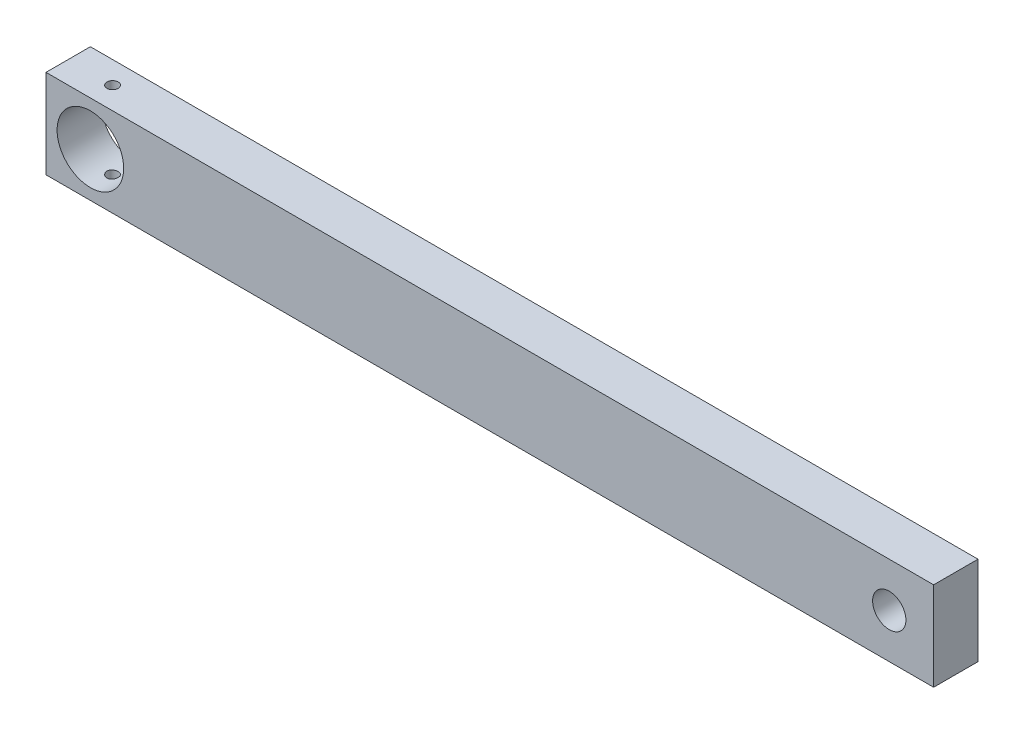
ISO-10303-21;
HEADER;
FILE_DESCRIPTION(('STEP AP214'),'2;1');
FILE_NAME('part.step','',(''),(''),'','','');
FILE_SCHEMA(('AUTOMOTIVE_DESIGN { 1 0 10303 214 1 1 1 1 }'));
ENDSEC;
DATA;
#1=APPLICATION_CONTEXT('core data for automotive mechanical design processes');
#2=APPLICATION_PROTOCOL_DEFINITION('international standard','automotive_design',2000,#1);
#3=PRODUCT_CONTEXT('',#1,'mechanical');
#4=PRODUCT('Part','Part','',(#3));
#5=PRODUCT_RELATED_PRODUCT_CATEGORY('part','',(#4));
#6=PRODUCT_DEFINITION_FORMATION('','',#4);
#7=PRODUCT_DEFINITION_CONTEXT('part definition',#1,'design');
#8=PRODUCT_DEFINITION('design','',#6,#7);
#9=PRODUCT_DEFINITION_SHAPE('','',#8);
#10=(LENGTH_UNIT() NAMED_UNIT(*) SI_UNIT(.MILLI.,.METRE.));
#11=(NAMED_UNIT(*) PLANE_ANGLE_UNIT() SI_UNIT($,.RADIAN.));
#12=(NAMED_UNIT(*) SI_UNIT($,.STERADIAN.) SOLID_ANGLE_UNIT());
#13=UNCERTAINTY_MEASURE_WITH_UNIT(LENGTH_MEASURE(1.E-05),#10,'distance_accuracy_value','');
#14=(GEOMETRIC_REPRESENTATION_CONTEXT(3) GLOBAL_UNCERTAINTY_ASSIGNED_CONTEXT((#13)) GLOBAL_UNIT_ASSIGNED_CONTEXT((#10,
#11,#12)) REPRESENTATION_CONTEXT('',''));
#15=CARTESIAN_POINT('',(0.,0.,0.));
#16=DIRECTION('',(0.,0.,1.));
#17=DIRECTION('',(1.,0.,0.));
#18=AXIS2_PLACEMENT_3D('',#15,#16,#17);
#19=CARTESIAN_POINT('',(0.,0.,6.35));
#20=DIRECTION('',(0.,0.,-1.));
#21=DIRECTION('',(-1.,0.,0.));
#22=AXIS2_PLACEMENT_3D('',#19,#20,#21);
#23=PLANE('',#22);
#24=DIRECTION('',(0.,-1.,0.));
#25=VECTOR('',#24,1.);
#26=CARTESIAN_POINT('',(0.,0.,6.35));
#27=LINE('',#26,#25);
#28=CARTESIAN_POINT('',(0.,12.7,6.35));
#29=VERTEX_POINT('',#28);
#30=CARTESIAN_POINT('',(0.,0.,6.35));
#31=VERTEX_POINT('',#30);
#32=EDGE_CURVE('E135',#29,#31,#27,.T.);
#33=ORIENTED_EDGE('',*,*,#32,.T.);
#34=DIRECTION('',(1.,0.,0.));
#35=VECTOR('',#34,1.);
#36=CARTESIAN_POINT('',(0.,0.,6.35));
#37=LINE('',#36,#35);
#38=CARTESIAN_POINT('',(127.,0.,6.35));
#39=VERTEX_POINT('',#38);
#40=EDGE_CURVE('E130',#31,#39,#37,.T.);
#41=ORIENTED_EDGE('',*,*,#40,.T.);
#42=DIRECTION('',(0.,1.,0.));
#43=VECTOR('',#42,1.);
#44=CARTESIAN_POINT('',(127.,0.,6.35));
#45=LINE('',#44,#43);
#46=CARTESIAN_POINT('',(127.,12.7,6.35));
#47=VERTEX_POINT('',#46);
#48=EDGE_CURVE('E133',#39,#47,#45,.T.);
#49=ORIENTED_EDGE('',*,*,#48,.T.);
#50=DIRECTION('',(-1.,0.,0.));
#51=VECTOR('',#50,1.);
#52=CARTESIAN_POINT('',(0.,12.7,6.35));
#53=LINE('',#52,#51);
#54=EDGE_CURVE('E100',#47,#29,#53,.T.);
#55=ORIENTED_EDGE('',*,*,#54,.T.);
#56=EDGE_LOOP('',(#33,#41,#49,#55));
#57=FACE_BOUND('',#56,.T.);
#58=CARTESIAN_POINT('',(6.35,6.35,6.35));
#59=DIRECTION('',(0.,0.,1.));
#60=DIRECTION('',(1.,0.,0.));
#61=AXIS2_PLACEMENT_3D('',#58,#59,#60);
#62=CIRCLE('',#61,4.7625);
#63=CARTESIAN_POINT('',(11.1125,6.35,6.35));
#64=VERTEX_POINT('',#63);
#65=EDGE_CURVE('E158',#64,#64,#62,.T.);
#66=ORIENTED_EDGE('',*,*,#65,.F.);
#67=EDGE_LOOP('',(#66));
#68=FACE_BOUND('',#67,.T.);
#69=CARTESIAN_POINT('',(120.65,6.35,6.35));
#70=DIRECTION('',(0.,0.,1.));
#71=DIRECTION('',(1.,0.,0.));
#72=AXIS2_PLACEMENT_3D('',#69,#70,#71);
#73=CIRCLE('',#72,2.38125000000001);
#74=CARTESIAN_POINT('',(123.03125,6.35,6.35));
#75=VERTEX_POINT('',#74);
#76=EDGE_CURVE('E225',#75,#75,#73,.T.);
#77=ORIENTED_EDGE('',*,*,#76,.F.);
#78=EDGE_LOOP('',(#77));
#79=FACE_BOUND('',#78,.T.);
#80=ADVANCED_FACE('F75',(#57,#68,#79),#23,.F.);
#81=CARTESIAN_POINT('',(0.,0.,0.));
#82=DIRECTION('',(0.,0.,-1.));
#83=DIRECTION('',(-1.,0.,0.));
#84=AXIS2_PLACEMENT_3D('',#81,#82,#83);
#85=PLANE('',#84);
#86=CARTESIAN_POINT('',(6.35,6.35,0.));
#87=DIRECTION('',(0.,0.,1.));
#88=DIRECTION('',(1.,0.,0.));
#89=AXIS2_PLACEMENT_3D('',#86,#87,#88);
#90=CIRCLE('',#89,4.7625);
#91=CARTESIAN_POINT('',(11.1125,6.35,0.));
#92=VERTEX_POINT('',#91);
#93=EDGE_CURVE('E228',#92,#92,#90,.T.);
#94=ORIENTED_EDGE('',*,*,#93,.T.);
#95=EDGE_LOOP('',(#94));
#96=FACE_BOUND('',#95,.T.);
#97=DIRECTION('',(0.,-1.,0.));
#98=VECTOR('',#97,1.);
#99=CARTESIAN_POINT('',(0.,0.,0.));
#100=LINE('',#99,#98);
#101=CARTESIAN_POINT('',(0.,12.7,0.));
#102=VERTEX_POINT('',#101);
#103=CARTESIAN_POINT('',(0.,0.,0.));
#104=VERTEX_POINT('',#103);
#105=EDGE_CURVE('E154',#102,#104,#100,.T.);
#106=ORIENTED_EDGE('',*,*,#105,.F.);
#107=DIRECTION('',(-1.,0.,0.));
#108=VECTOR('',#107,1.);
#109=CARTESIAN_POINT('',(0.,12.7,0.));
#110=LINE('',#109,#108);
#111=CARTESIAN_POINT('',(127.,12.7,0.));
#112=VERTEX_POINT('',#111);
#113=EDGE_CURVE('E123',#112,#102,#110,.T.);
#114=ORIENTED_EDGE('',*,*,#113,.F.);
#115=DIRECTION('',(0.,1.,0.));
#116=VECTOR('',#115,1.);
#117=CARTESIAN_POINT('',(127.,0.,0.));
#118=LINE('',#117,#116);
#119=CARTESIAN_POINT('',(127.,0.,0.));
#120=VERTEX_POINT('',#119);
#121=EDGE_CURVE('E117',#120,#112,#118,.T.);
#122=ORIENTED_EDGE('',*,*,#121,.F.);
#123=DIRECTION('',(1.,0.,0.));
#124=VECTOR('',#123,1.);
#125=CARTESIAN_POINT('',(0.,0.,0.));
#126=LINE('',#125,#124);
#127=EDGE_CURVE('E140',#104,#120,#126,.T.);
#128=ORIENTED_EDGE('',*,*,#127,.F.);
#129=EDGE_LOOP('',(#106,#114,#122,#128));
#130=FACE_BOUND('',#129,.T.);
#131=CARTESIAN_POINT('',(120.65,6.35,0.));
#132=DIRECTION('',(0.,0.,1.));
#133=DIRECTION('',(1.,0.,0.));
#134=AXIS2_PLACEMENT_3D('',#131,#132,#133);
#135=CIRCLE('',#134,2.38125000000001);
#136=CARTESIAN_POINT('',(123.03125,6.35,0.));
#137=VERTEX_POINT('',#136);
#138=EDGE_CURVE('E229',#137,#137,#135,.T.);
#139=ORIENTED_EDGE('',*,*,#138,.T.);
#140=EDGE_LOOP('',(#139));
#141=FACE_BOUND('',#140,.T.);
#142=ADVANCED_FACE('F196',(#96,#130,#141),#85,.T.);
#143=CARTESIAN_POINT('',(0.,0.,6.35));
#144=DIRECTION('',(1.,0.,0.));
#145=DIRECTION('',(0.,0.,-1.));
#146=AXIS2_PLACEMENT_3D('',#143,#144,#145);
#147=PLANE('',#146);
#148=ORIENTED_EDGE('',*,*,#105,.T.);
#149=DIRECTION('',(0.,0.,-1.));
#150=VECTOR('',#149,1.);
#151=CARTESIAN_POINT('',(0.,0.,6.35));
#152=LINE('',#151,#150);
#153=EDGE_CURVE('E13',#31,#104,#152,.T.);
#154=ORIENTED_EDGE('',*,*,#153,.F.);
#155=ORIENTED_EDGE('',*,*,#32,.F.);
#156=DIRECTION('',(0.,0.,-1.));
#157=VECTOR('',#156,1.);
#158=CARTESIAN_POINT('',(0.,12.7,6.35));
#159=LINE('',#158,#157);
#160=EDGE_CURVE('E150',#29,#102,#159,.T.);
#161=ORIENTED_EDGE('',*,*,#160,.T.);
#162=EDGE_LOOP('',(#148,#154,#155,#161));
#163=FACE_BOUND('',#162,.T.);
#164=ADVANCED_FACE('F77',(#163),#147,.F.);
#165=CARTESIAN_POINT('',(0.,0.,6.35));
#166=DIRECTION('',(0.,1.,0.));
#167=DIRECTION('',(0.,0.,1.));
#168=AXIS2_PLACEMENT_3D('',#165,#166,#167);
#169=PLANE('',#168);
#170=CARTESIAN_POINT('',(6.35,0.,3.175));
#171=DIRECTION('',(0.,1.,0.));
#172=DIRECTION('',(0.,0.,1.));
#173=AXIS2_PLACEMENT_3D('',#170,#171,#172);
#174=CIRCLE('',#173,0.8001);
#175=CARTESIAN_POINT('',(6.35,0.,3.9751));
#176=VERTEX_POINT('',#175);
#177=EDGE_CURVE('E174',#176,#176,#174,.T.);
#178=ORIENTED_EDGE('',*,*,#177,.T.);
#179=EDGE_LOOP('',(#178));
#180=FACE_BOUND('',#179,.T.);
#181=ORIENTED_EDGE('',*,*,#127,.T.);
#182=DIRECTION('',(0.,0.,-1.));
#183=VECTOR('',#182,1.);
#184=CARTESIAN_POINT('',(127.,0.,6.35));
#185=LINE('',#184,#183);
#186=EDGE_CURVE('E91',#39,#120,#185,.T.);
#187=ORIENTED_EDGE('',*,*,#186,.F.);
#188=ORIENTED_EDGE('',*,*,#40,.F.);
#189=ORIENTED_EDGE('',*,*,#153,.T.);
#190=EDGE_LOOP('',(#181,#187,#188,#189));
#191=FACE_BOUND('',#190,.T.);
#192=ADVANCED_FACE('F139',(#180,#191),#169,.F.);
#193=CARTESIAN_POINT('',(127.,0.,6.35));
#194=DIRECTION('',(-1.,0.,0.));
#195=DIRECTION('',(0.,0.,1.));
#196=AXIS2_PLACEMENT_3D('',#193,#194,#195);
#197=PLANE('',#196);
#198=ORIENTED_EDGE('',*,*,#121,.T.);
#199=DIRECTION('',(0.,0.,-1.));
#200=VECTOR('',#199,1.);
#201=CARTESIAN_POINT('',(127.,12.7,6.35));
#202=LINE('',#201,#200);
#203=EDGE_CURVE('E142',#47,#112,#202,.T.);
#204=ORIENTED_EDGE('',*,*,#203,.F.);
#205=ORIENTED_EDGE('',*,*,#48,.F.);
#206=ORIENTED_EDGE('',*,*,#186,.T.);
#207=EDGE_LOOP('',(#198,#204,#205,#206));
#208=FACE_BOUND('',#207,.T.);
#209=ADVANCED_FACE('F144',(#208),#197,.F.);
#210=CARTESIAN_POINT('',(0.,12.7,6.35));
#211=DIRECTION('',(0.,-1.,0.));
#212=DIRECTION('',(0.,0.,-1.));
#213=AXIS2_PLACEMENT_3D('',#210,#211,#212);
#214=PLANE('',#213);
#215=CARTESIAN_POINT('',(6.35,12.7,3.175));
#216=DIRECTION('',(0.,1.,0.));
#217=DIRECTION('',(0.,0.,1.));
#218=AXIS2_PLACEMENT_3D('',#215,#216,#217);
#219=CIRCLE('',#218,0.8001);
#220=CARTESIAN_POINT('',(6.35,12.7,3.9751));
#221=VERTEX_POINT('',#220);
#222=EDGE_CURVE('E217',#221,#221,#219,.T.);
#223=ORIENTED_EDGE('',*,*,#222,.F.);
#224=EDGE_LOOP('',(#223));
#225=FACE_BOUND('',#224,.T.);
#226=ORIENTED_EDGE('',*,*,#113,.T.);
#227=ORIENTED_EDGE('',*,*,#160,.F.);
#228=ORIENTED_EDGE('',*,*,#54,.F.);
#229=ORIENTED_EDGE('',*,*,#203,.T.);
#230=EDGE_LOOP('',(#226,#227,#228,#229));
#231=FACE_BOUND('',#230,.T.);
#232=ADVANCED_FACE('F191',(#225,#231),#214,.F.);
#233=CARTESIAN_POINT('',(6.35,6.35,6.35));
#234=DIRECTION('',(0.,0.,-1.));
#235=DIRECTION('',(-1.,0.,0.));
#236=AXIS2_PLACEMENT_3D('',#233,#234,#235);
#237=CYLINDRICAL_SURFACE('',#236,4.7625);
#238=CARTESIAN_POINT('',(6.35,1.5875,3.9751));
#239=CARTESIAN_POINT('',(6.39460540009874,1.58750076770223,3.97509821617908));
#240=CARTESIAN_POINT('',(6.43923501286809,1.5881331827757,3.97135728725494));
#241=CARTESIAN_POINT('',(6.52724215788949,1.59059510979933,3.95649884134994));
#242=CARTESIAN_POINT('',(6.57061850658137,1.59242571704917,3.94537457493112));
#243=CARTESIAN_POINT('',(6.65483313843166,1.59707873492487,3.91609511082178));
#244=CARTESIAN_POINT('',(6.69567347891527,1.5999003289127,3.89794570105642));
#245=CARTESIAN_POINT('',(6.77372411415339,1.60622520681594,3.85514637849176));
#246=CARTESIAN_POINT('',(6.81093481600617,1.60972841414967,3.83049719585452));
#247=CARTESIAN_POINT('',(6.88103622651018,1.61706629000199,3.77514353217));
#248=CARTESIAN_POINT('',(6.91388659096695,1.62090357401267,3.74438829941445));
#249=CARTESIAN_POINT('',(6.97398629868229,1.62845713545384,3.67780479795952));
#250=CARTESIAN_POINT('',(7.00123528553963,1.63217340517183,3.64197620670021));
#251=CARTESIAN_POINT('',(7.04952078981396,1.63908950677721,3.56598541274977));
#252=CARTESIAN_POINT('',(7.07051734353125,1.64228595963226,3.52579748223831));
#253=CARTESIAN_POINT('',(7.10544638783667,1.64776419638311,3.44240240755171));
#254=CARTESIAN_POINT('',(7.1193793634694,1.6500460430812,3.39919547091877));
#255=CARTESIAN_POINT('',(7.1396584903316,1.65341065847744,3.31141677195161));
#256=CARTESIAN_POINT('',(7.14607433562413,1.65450443517306,3.26686154067432));
#257=CARTESIAN_POINT('',(7.15135318074049,1.65540236318285,3.1772945531363));
#258=CARTESIAN_POINT('',(7.15021672365666,1.6552066072284,3.13228282993469));
#259=CARTESIAN_POINT('',(7.14047997643101,1.6535576364793,3.04357853797948));
#260=CARTESIAN_POINT('',(7.1319580356916,1.65211762196222,2.99987708796147));
#261=CARTESIAN_POINT('',(7.10781521109713,1.64816305500743,2.91453321003823));
#262=CARTESIAN_POINT('',(7.09219408020176,1.64564846517642,2.87289085384205));
#263=CARTESIAN_POINT('',(7.05421703782634,1.63981384739601,2.79261300617326));
#264=CARTESIAN_POINT('',(7.03182864618101,1.63648995040028,2.75399317285886));
#265=CARTESIAN_POINT('',(6.9809756617649,1.62941391642497,2.68102874593125));
#266=CARTESIAN_POINT('',(6.95251057088256,1.6256617443511,2.64668450315697));
#267=CARTESIAN_POINT('',(6.88988559196673,1.61809396393052,2.58279269223909));
#268=CARTESIAN_POINT('',(6.85565849377026,1.61427815182438,2.55331098606491));
#269=CARTESIAN_POINT('',(6.78270824415339,1.6070567066151,2.50049924960312));
#270=CARTESIAN_POINT('',(6.74398506289643,1.60365107623429,2.47716926014242));
#271=CARTESIAN_POINT('',(6.6630795185285,1.5976287638992,2.43731699251884));
#272=CARTESIAN_POINT('',(6.62089420476571,1.59501276398907,2.42080059511407));
#273=CARTESIAN_POINT('',(6.53429461928307,1.59086992881502,2.39510580457021));
#274=CARTESIAN_POINT('',(6.48988053740102,1.58934300095616,2.38592678758525));
#275=CARTESIAN_POINT('',(6.40065177442786,1.58756282072796,2.37525674532038));
#276=CARTESIAN_POINT('',(6.35584819235659,1.5872945918809,2.37367531565045));
#277=CARTESIAN_POINT('',(6.26661628079178,1.58802099119031,2.37800422771815));
#278=CARTESIAN_POINT('',(6.22218793668808,1.58901556994814,2.38391427640325));
#279=CARTESIAN_POINT('',(6.135247355807,1.59214655581168,2.40298318915377));
#280=CARTESIAN_POINT('',(6.0927250128063,1.59427590090318,2.41609723581654));
#281=CARTESIAN_POINT('',(6.01048244550533,1.59943861723081,2.44915406416077));
#282=CARTESIAN_POINT('',(5.97076238080741,1.60247203990689,2.46909723441346));
#283=CARTESIAN_POINT('',(5.89485960813383,1.60914356212735,2.51545282774509));
#284=CARTESIAN_POINT('',(5.85871180695555,1.61278683906465,2.54192164775844));
#285=CARTESIAN_POINT('',(5.79133876446139,1.62025846586637,2.60049968504872));
#286=CARTESIAN_POINT('',(5.76011388713121,1.6240868293882,2.63260931901918));
#287=CARTESIAN_POINT('',(5.70313743010013,1.63154565169308,2.70196320862219));
#288=CARTESIAN_POINT('',(5.67744697009715,1.63517360097322,2.73925798865968));
#289=CARTESIAN_POINT('',(5.6326956376512,1.64177373913438,2.81768686242722));
#290=CARTESIAN_POINT('',(5.61363455262382,1.6447459490419,2.85882083299216));
#291=CARTESIAN_POINT('',(5.58277416763561,1.64967920124801,2.94359050648473));
#292=CARTESIAN_POINT('',(5.57094459201071,1.65164445363015,2.98721493145495));
#293=CARTESIAN_POINT('',(5.55478786007843,1.65435178372083,3.07586743635016));
#294=CARTESIAN_POINT('',(5.55046004000674,1.65509396964746,3.12089539173016));
#295=CARTESIAN_POINT('',(5.54944840761635,1.65526641901656,3.21046634448804));
#296=CARTESIAN_POINT('',(5.55266837825689,1.65471319605043,3.25500825257629));
#297=CARTESIAN_POINT('',(5.5664527136095,1.65239337955988,3.34290688979951));
#298=CARTESIAN_POINT('',(5.57701705340841,1.65062679015138,3.38626362295425));
#299=CARTESIAN_POINT('',(5.60515315331648,1.64608560801092,3.47052307862032));
#300=CARTESIAN_POINT('',(5.62271649916831,1.64331222600771,3.51142868021608));
#301=CARTESIAN_POINT('',(5.66434213109452,1.63706879613128,3.58972824461151));
#302=CARTESIAN_POINT('',(5.68840474798398,1.63359871279802,3.62712202852787));
#303=CARTESIAN_POINT('',(5.74268872213401,1.62630058457103,3.69782235117209));
#304=CARTESIAN_POINT('',(5.77298081981542,1.62246872904552,3.73107418965288));
#305=CARTESIAN_POINT('',(5.83871481013018,1.61490908695692,3.79205565744417));
#306=CARTESIAN_POINT('',(5.87415788908142,1.61118132460386,3.81978401114883));
#307=CARTESIAN_POINT('',(5.94948397642078,1.60421950240863,3.86910977331679));
#308=CARTESIAN_POINT('',(5.98939643911533,1.6009890965867,3.89066272207236));
#309=CARTESIAN_POINT('',(6.07231363438912,1.59542152970421,3.92672475774141));
#310=CARTESIAN_POINT('',(6.11531524886199,1.59308348256462,3.94124083589617));
#311=CARTESIAN_POINT('',(6.19040132520967,1.5900722581992,3.95967861842604));
#312=CARTESIAN_POINT('',(6.222032428384,1.58911283480724,3.96545233746516));
#313=CARTESIAN_POINT('',(6.28577150816969,1.58782643487985,3.97316363664481));
#314=CARTESIAN_POINT('',(6.31787947634877,1.58749944717461,3.97510128453645));
#315=CARTESIAN_POINT('',(6.35,1.5875,3.9751));
#316=B_SPLINE_CURVE_WITH_KNOTS('',3,(#238,#239,#240,#241,#242,#243,#244,#245,#246,#247,#248,
#249,#250,#251,#252,#253,#254,#255,#256,#257,#258,#259,#260,#261,#262,#263,#264,#265,#266,#267,
#268,#269,#270,#271,#272,#273,#274,#275,#276,#277,#278,#279,#280,#281,#282,#283,#284,#285,#286,
#287,#288,#289,#290,#291,#292,#293,#294,#295,#296,#297,#298,#299,#300,#301,#302,#303,#304,#305,
#306,#307,#308,#309,#310,#311,#312,#313,#314,#315),.UNSPECIFIED.,.T.,.F.,(4,2,2,2,2,2,2,2,2,2,2,
2,2,2,2,2,2,2,2,2,2,2,2,2,2,2,2,2,2,2,2,2,2,2,2,2,2,2,4),(0.,0.133698787022285,
0.267519962712405,0.401231118731839,0.534927260495666,0.669785045318576,0.804651408140859,
0.940362154134235,1.07606357982531,1.21049665449697,1.34492006207928,1.47793464746145,
1.61095386189029,1.74462193613758,1.87830097146653,2.01366368685505,2.14902730057874,
2.28450750237614,2.41997618401907,2.55382885031589,2.68767628071004,2.82070029977062,
2.9537318890407,3.08795617049955,3.22219037143546,3.35783857589926,3.49348243012581,
3.6285544331202,3.76361448417167,3.89696220932928,4.03030948215408,4.16349692519966,
4.29669114880884,4.43149087736186,4.56632170086371,4.70210015352191,4.83774343027008,
4.93402215191436,5.03029917310873),.UNSPECIFIED.);
#317=CARTESIAN_POINT('',(6.35,1.5875,3.9751));
#318=VERTEX_POINT('',#317);
#319=EDGE_CURVE('E79',#318,#318,#316,.T.);
#320=ORIENTED_EDGE('',*,*,#319,.F.);
#321=EDGE_LOOP('',(#320));
#322=FACE_BOUND('',#321,.T.);
#323=CARTESIAN_POINT('',(6.35,11.1125,3.9751));
#324=CARTESIAN_POINT('',(6.30539459990126,11.1124992322978,3.97509821617908));
#325=CARTESIAN_POINT('',(6.26076498713191,11.1118668172243,3.97135728725494));
#326=CARTESIAN_POINT('',(6.17275784211051,11.1094048902007,3.95649884134994));
#327=CARTESIAN_POINT('',(6.12938149341863,11.1075742829508,3.94537457493112));
#328=CARTESIAN_POINT('',(6.04516686156834,11.1029212650751,3.91609511082178));
#329=CARTESIAN_POINT('',(6.00432652108473,11.1000996710873,3.89794570105642));
#330=CARTESIAN_POINT('',(5.92627588584661,11.0937747931841,3.85514637849176));
#331=CARTESIAN_POINT('',(5.88906518399383,11.0902715858503,3.83049719585452));
#332=CARTESIAN_POINT('',(5.81896377348982,11.082933709998,3.77514353217));
#333=CARTESIAN_POINT('',(5.78611340903305,11.0790964259873,3.74438829941445));
#334=CARTESIAN_POINT('',(5.72601370131771,11.0715428645462,3.67780479795952));
#335=CARTESIAN_POINT('',(5.69876471446037,11.0678265948282,3.64197620670021));
#336=CARTESIAN_POINT('',(5.65047921018604,11.0609104932228,3.56598541274977));
#337=CARTESIAN_POINT('',(5.62948265646875,11.0577140403677,3.52579748223831));
#338=CARTESIAN_POINT('',(5.59455361216333,11.0522358036169,3.44240240755171));
#339=CARTESIAN_POINT('',(5.5806206365306,11.0499539569188,3.39919547091877));
#340=CARTESIAN_POINT('',(5.5603415096684,11.0465893415226,3.31141677195161));
#341=CARTESIAN_POINT('',(5.55392566437587,11.0454955648269,3.26686154067432));
#342=CARTESIAN_POINT('',(5.54864681925951,11.0445976368171,3.1772945531363));
#343=CARTESIAN_POINT('',(5.54978327634333,11.0447933927716,3.13228282993469));
#344=CARTESIAN_POINT('',(5.55952002356899,11.0464423635207,3.04357853797948));
#345=CARTESIAN_POINT('',(5.5680419643084,11.0478823780378,2.99987708796147));
#346=CARTESIAN_POINT('',(5.59218478890287,11.0518369449926,2.91453321003823));
#347=CARTESIAN_POINT('',(5.60780591979824,11.0543515348236,2.87289085384205));
#348=CARTESIAN_POINT('',(5.64578296217366,11.060186152604,2.79261300617326));
#349=CARTESIAN_POINT('',(5.66817135381899,11.0635100495997,2.75399317285886));
#350=CARTESIAN_POINT('',(5.7190243382351,11.070586083575,2.68102874593125));
#351=CARTESIAN_POINT('',(5.74748942911744,11.0743382556489,2.64668450315697));
#352=CARTESIAN_POINT('',(5.81011440803327,11.0819060360695,2.58279269223909));
#353=CARTESIAN_POINT('',(5.84434150622974,11.0857218481756,2.55331098606491));
#354=CARTESIAN_POINT('',(5.91729175584661,11.0929432933849,2.50049924960312));
#355=CARTESIAN_POINT('',(5.95601493710357,11.0963489237657,2.47716926014242));
#356=CARTESIAN_POINT('',(6.0369204814715,11.1023712361008,2.43731699251884));
#357=CARTESIAN_POINT('',(6.07910579523429,11.1049872360109,2.42080059511407));
#358=CARTESIAN_POINT('',(6.16570538071693,11.109130071185,2.39510580457021));
#359=CARTESIAN_POINT('',(6.21011946259898,11.1106569990438,2.38592678758525));
#360=CARTESIAN_POINT('',(6.29934822557214,11.112437179272,2.37525674532038));
#361=CARTESIAN_POINT('',(6.34415180764341,11.1127054081191,2.37367531565045));
#362=CARTESIAN_POINT('',(6.43338371920822,11.1119790088097,2.37800422771815));
#363=CARTESIAN_POINT('',(6.47781206331193,11.1109844300519,2.38391427640325));
#364=CARTESIAN_POINT('',(6.564752644193,11.1078534441883,2.40298318915377));
#365=CARTESIAN_POINT('',(6.6072749871937,11.1057240990968,2.41609723581654));
#366=CARTESIAN_POINT('',(6.68951755449467,11.1005613827692,2.44915406416077));
#367=CARTESIAN_POINT('',(6.72923761919259,11.0975279600931,2.46909723441346));
#368=CARTESIAN_POINT('',(6.80514039186617,11.0908564378727,2.51545282774509));
#369=CARTESIAN_POINT('',(6.84128819304445,11.0872131609353,2.54192164775844));
#370=CARTESIAN_POINT('',(6.9086612355386,11.0797415341336,2.60049968504872));
#371=CARTESIAN_POINT('',(6.93988611286879,11.0759131706118,2.63260931901918));
#372=CARTESIAN_POINT('',(6.99686256989987,11.0684543483069,2.70196320862219));
#373=CARTESIAN_POINT('',(7.02255302990285,11.0648263990268,2.73925798865967));
#374=CARTESIAN_POINT('',(7.0673043623488,11.0582262608656,2.81768686242722));
#375=CARTESIAN_POINT('',(7.08636544737618,11.0552540509581,2.85882083299215));
#376=CARTESIAN_POINT('',(7.11722583236439,11.050320798752,2.94359050648472));
#377=CARTESIAN_POINT('',(7.12905540798929,11.0483555463698,2.98721493145495));
#378=CARTESIAN_POINT('',(7.14521213992157,11.0456482162792,3.07586743635016));
#379=CARTESIAN_POINT('',(7.14953995999326,11.0449060303525,3.12089539173016));
#380=CARTESIAN_POINT('',(7.15055159238365,11.0447335809834,3.21046634448804));
#381=CARTESIAN_POINT('',(7.14733162174311,11.0452868039496,3.25500825257629));
#382=CARTESIAN_POINT('',(7.1335472863905,11.0476066204401,3.34290688979951));
#383=CARTESIAN_POINT('',(7.12298294659159,11.0493732098486,3.38626362295425));
#384=CARTESIAN_POINT('',(7.09484684668351,11.0539143919891,3.47052307862032));
#385=CARTESIAN_POINT('',(7.07728350083169,11.0566877739923,3.51142868021608));
#386=CARTESIAN_POINT('',(7.03565786890548,11.0629312038687,3.58972824461151));
#387=CARTESIAN_POINT('',(7.01159525201602,11.066401287202,3.62712202852787));
#388=CARTESIAN_POINT('',(6.95731127786599,11.073699415429,3.69782235117209));
#389=CARTESIAN_POINT('',(6.92701918018458,11.0775312709545,3.73107418965288));
#390=CARTESIAN_POINT('',(6.86128518986982,11.0850909130431,3.79205565744417));
#391=CARTESIAN_POINT('',(6.82584211091858,11.0888186753961,3.81978401114882));
#392=CARTESIAN_POINT('',(6.75051602357922,11.0957804975914,3.86910977331679));
#393=CARTESIAN_POINT('',(6.71060356088467,11.0990109034133,3.89066272207236));
#394=CARTESIAN_POINT('',(6.62768636561088,11.1045784702958,3.92672475774141));
#395=CARTESIAN_POINT('',(6.58468475113801,11.1069165174354,3.94124083589617));
#396=CARTESIAN_POINT('',(6.50959867479033,11.1099277418008,3.95967861842604));
#397=CARTESIAN_POINT('',(6.477967571616,11.1108871651928,3.96545233746516));
#398=CARTESIAN_POINT('',(6.41422849183031,11.1121735651201,3.97316363664481));
#399=CARTESIAN_POINT('',(6.38212052365123,11.1125005528254,3.97510128453645));
#400=CARTESIAN_POINT('',(6.35,11.1125,3.9751));
#401=B_SPLINE_CURVE_WITH_KNOTS('',3,(#323,#324,#325,#326,#327,#328,#329,#330,#331,#332,#333,
#334,#335,#336,#337,#338,#339,#340,#341,#342,#343,#344,#345,#346,#347,#348,#349,#350,#351,#352,
#353,#354,#355,#356,#357,#358,#359,#360,#361,#362,#363,#364,#365,#366,#367,#368,#369,#370,#371,
#372,#373,#374,#375,#376,#377,#378,#379,#380,#381,#382,#383,#384,#385,#386,#387,#388,#389,#390,
#391,#392,#393,#394,#395,#396,#397,#398,#399,#400),.UNSPECIFIED.,.T.,.F.,(4,2,2,2,2,2,2,2,2,2,2,
2,2,2,2,2,2,2,2,2,2,2,2,2,2,2,2,2,2,2,2,2,2,2,2,2,2,2,4),(0.,0.133698787022285,
0.267519962712405,0.401231118731839,0.534927260495666,0.669785045318576,0.804651408140859,
0.940362154134235,1.07606357982531,1.21049665449697,1.34492006207928,1.47793464746145,
1.61095386189029,1.74462193613758,1.87830097146653,2.01366368685506,2.14902730057874,
2.28450750237614,2.41997618401907,2.5538288503159,2.68767628071004,2.82070029977062,
2.9537318890407,3.08795617049955,3.22219037143545,3.35783857589926,3.4934824301258,
3.6285544331202,3.76361448417167,3.89696220932927,4.03030948215408,4.16349692519966,
4.29669114880884,4.43149087736186,4.56632170086371,4.70210015352191,4.83774343027008,
4.93402215191436,5.03029917310873),.UNSPECIFIED.);
#402=CARTESIAN_POINT('',(6.35,11.1125,3.9751));
#403=VERTEX_POINT('',#402);
#404=EDGE_CURVE('E168',#403,#403,#401,.T.);
#405=ORIENTED_EDGE('',*,*,#404,.F.);
#406=EDGE_LOOP('',(#405));
#407=FACE_BOUND('',#406,.T.);
#408=ORIENTED_EDGE('',*,*,#65,.T.);
#409=EDGE_LOOP('',(#408));
#410=FACE_BOUND('',#409,.T.);
#411=ORIENTED_EDGE('',*,*,#93,.F.);
#412=EDGE_LOOP('',(#411));
#413=FACE_BOUND('',#412,.T.);
#414=ADVANCED_FACE('F175',(#322,#407,#410,#413),#237,.F.);
#415=CARTESIAN_POINT('',(120.65,6.35,6.35));
#416=DIRECTION('',(0.,0.,-1.));
#417=DIRECTION('',(-1.,0.,0.));
#418=AXIS2_PLACEMENT_3D('',#415,#416,#417);
#419=CYLINDRICAL_SURFACE('',#418,2.38125000000001);
#420=ORIENTED_EDGE('',*,*,#76,.T.);
#421=EDGE_LOOP('',(#420));
#422=FACE_BOUND('',#421,.T.);
#423=ORIENTED_EDGE('',*,*,#138,.F.);
#424=EDGE_LOOP('',(#423));
#425=FACE_BOUND('',#424,.T.);
#426=ADVANCED_FACE('F183',(#422,#425),#419,.F.);
#427=CARTESIAN_POINT('',(6.35,0.,3.175));
#428=DIRECTION('',(0.,1.,0.));
#429=DIRECTION('',(0.,0.,1.));
#430=AXIS2_PLACEMENT_3D('',#427,#428,#429);
#431=CYLINDRICAL_SURFACE('',#430,0.8001);
#432=ORIENTED_EDGE('',*,*,#404,.T.);
#433=EDGE_LOOP('',(#432));
#434=FACE_BOUND('',#433,.T.);
#435=ORIENTED_EDGE('',*,*,#222,.T.);
#436=EDGE_LOOP('',(#435));
#437=FACE_BOUND('',#436,.T.);
#438=ADVANCED_FACE('F179',(#434,#437),#431,.F.);
#439=ORIENTED_EDGE('',*,*,#319,.T.);
#440=EDGE_LOOP('',(#439));
#441=FACE_BOUND('',#440,.T.);
#442=ORIENTED_EDGE('',*,*,#177,.F.);
#443=EDGE_LOOP('',(#442));
#444=FACE_BOUND('',#443,.T.);
#445=ADVANCED_FACE('F182',(#441,#444),#431,.F.);
#446=CLOSED_SHELL('',(#80,#142,#164,#192,#209,#232,#414,#426,#438,#445));
#447=MANIFOLD_SOLID_BREP('B2',#446);
#448=ADVANCED_BREP_SHAPE_REPRESENTATION('',(#18,#447),#14);
#449=SHAPE_DEFINITION_REPRESENTATION(#9,#448);
ENDSEC;
END-ISO-10303-21;
